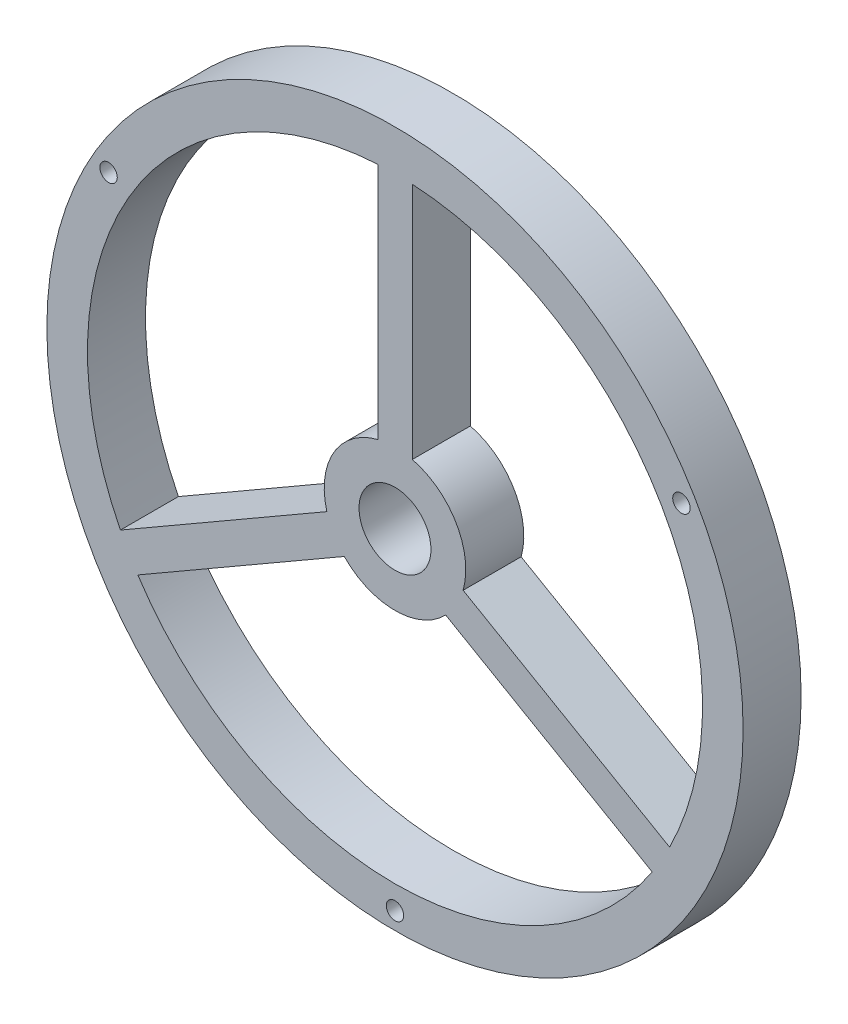
ISO-10303-21;
HEADER;
FILE_DESCRIPTION(('STEP AP214'),'2;1');
FILE_NAME('part.step','',(''),(''),'','','');
FILE_SCHEMA(('AUTOMOTIVE_DESIGN { 1 0 10303 214 1 1 1 1 }'));
ENDSEC;
DATA;
#1=APPLICATION_CONTEXT('core data for automotive mechanical design processes');
#2=APPLICATION_PROTOCOL_DEFINITION('international standard','automotive_design',2000,#1);
#3=PRODUCT_CONTEXT('',#1,'mechanical');
#4=PRODUCT('Part','Part','',(#3));
#5=PRODUCT_RELATED_PRODUCT_CATEGORY('part','',(#4));
#6=PRODUCT_DEFINITION_FORMATION('','',#4);
#7=PRODUCT_DEFINITION_CONTEXT('part definition',#1,'design');
#8=PRODUCT_DEFINITION('design','',#6,#7);
#9=PRODUCT_DEFINITION_SHAPE('','',#8);
#10=(LENGTH_UNIT() NAMED_UNIT(*) SI_UNIT(.MILLI.,.METRE.));
#11=(NAMED_UNIT(*) PLANE_ANGLE_UNIT() SI_UNIT($,.RADIAN.));
#12=(NAMED_UNIT(*) SI_UNIT($,.STERADIAN.) SOLID_ANGLE_UNIT());
#13=UNCERTAINTY_MEASURE_WITH_UNIT(LENGTH_MEASURE(1.E-05),#10,'distance_accuracy_value','');
#14=(GEOMETRIC_REPRESENTATION_CONTEXT(3) GLOBAL_UNCERTAINTY_ASSIGNED_CONTEXT((#13)) GLOBAL_UNIT_ASSIGNED_CONTEXT((#10,
#11,#12)) REPRESENTATION_CONTEXT('',''));
#15=CARTESIAN_POINT('',(0.,0.,0.));
#16=DIRECTION('',(0.,0.,1.));
#17=DIRECTION('',(1.,0.,0.));
#18=AXIS2_PLACEMENT_3D('',#15,#16,#17);
#19=CARTESIAN_POINT('',(48.2964743549606,27.9249074552953,5.));
#20=DIRECTION('',(0.,0.,-1.));
#21=DIRECTION('',(-1.,0.,0.));
#22=AXIS2_PLACEMENT_3D('',#19,#20,#21);
#23=CYLINDRICAL_SURFACE('',#22,26.5);
#24=CARTESIAN_POINT('',(48.2964743549606,27.9249074552953,0.));
#25=DIRECTION('',(0.,0.,1.));
#26=DIRECTION('',(1.,0.,0.));
#27=AXIS2_PLACEMENT_3D('',#24,#25,#26);
#28=CIRCLE('',#27,26.5);
#29=CARTESIAN_POINT('',(71.9593528297398,15.995189005649,0.));
#30=VERTEX_POINT('',#29);
#31=CARTESIAN_POINT('',(49.7879309777147,54.3829035461265,0.));
#32=VERTEX_POINT('',#31);
#33=EDGE_CURVE('E215',#30,#32,#28,.T.);
#34=ORIENTED_EDGE('',*,*,#33,.F.);
#35=DIRECTION('',(0.,0.,-1.));
#36=VECTOR('',#35,1.);
#37=CARTESIAN_POINT('',(71.9593528297398,15.995189005649,5.));
#38=LINE('',#37,#36);
#39=CARTESIAN_POINT('',(71.9593528297398,15.995189005649,5.));
#40=VERTEX_POINT('',#39);
#41=EDGE_CURVE('E11',#40,#30,#38,.T.);
#42=ORIENTED_EDGE('',*,*,#41,.F.);
#43=CARTESIAN_POINT('',(48.2964743549606,27.9249074552953,5.));
#44=DIRECTION('',(0.,0.,1.));
#45=DIRECTION('',(1.,0.,0.));
#46=AXIS2_PLACEMENT_3D('',#43,#44,#45);
#47=CIRCLE('',#46,26.5);
#48=CARTESIAN_POINT('',(49.7879309777147,54.3829035461265,5.));
#49=VERTEX_POINT('',#48);
#50=EDGE_CURVE('E147',#40,#49,#47,.T.);
#51=ORIENTED_EDGE('',*,*,#50,.T.);
#52=DIRECTION('',(0.,0.,-1.));
#53=VECTOR('',#52,1.);
#54=CARTESIAN_POINT('',(49.7879309777147,54.3829035461265,5.));
#55=LINE('',#54,#53);
#56=EDGE_CURVE('E54',#49,#32,#55,.T.);
#57=ORIENTED_EDGE('',*,*,#56,.T.);
#58=EDGE_LOOP('',(#34,#42,#51,#57));
#59=FACE_BOUND('',#58,.T.);
#60=ADVANCED_FACE('F35',(#59),#23,.F.);
#61=CARTESIAN_POINT('',(24.9159582160477,43.1557055494579,5.));
#62=DIRECTION('',(-0.5,-0.866025403784439,0.));
#63=DIRECTION('',(0.866025403784439,-0.5,0.));
#64=AXIS2_PLACEMENT_3D('',#61,#62,#63);
#65=PLANE('',#64);
#66=DIRECTION('',(-0.866025403784439,0.5,0.));
#67=VECTOR('',#66,1.);
#68=CARTESIAN_POINT('',(24.9159582160477,43.1557055494579,0.));
#69=LINE('',#68,#67);
#70=CARTESIAN_POINT('',(54.1670212007574,26.267596461153,0.));
#71=VERTEX_POINT('',#70);
#72=EDGE_CURVE('E152',#30,#71,#69,.T.);
#73=ORIENTED_EDGE('',*,*,#72,.T.);
#74=DIRECTION('',(0.,0.,-1.));
#75=VECTOR('',#74,1.);
#76=CARTESIAN_POINT('',(54.1670212007574,26.267596461153,5.));
#77=LINE('',#76,#75);
#78=CARTESIAN_POINT('',(54.1670212007574,26.267596461153,5.));
#79=VERTEX_POINT('',#78);
#80=EDGE_CURVE('E45',#79,#71,#77,.T.);
#81=ORIENTED_EDGE('',*,*,#80,.F.);
#82=DIRECTION('',(-0.866025403784439,0.5,0.));
#83=VECTOR('',#82,1.);
#84=CARTESIAN_POINT('',(24.9159582160477,43.1557055494579,5.));
#85=LINE('',#84,#83);
#86=EDGE_CURVE('E139',#40,#79,#85,.T.);
#87=ORIENTED_EDGE('',*,*,#86,.F.);
#88=ORIENTED_EDGE('',*,*,#41,.T.);
#89=EDGE_LOOP('',(#73,#81,#87,#88));
#90=FACE_BOUND('',#89,.T.);
#91=ADVANCED_FACE('F150',(#90),#65,.F.);
#92=CARTESIAN_POINT('',(48.2964743549606,27.9249074552953,5.));
#93=DIRECTION('',(0.,0.,-1.));
#94=DIRECTION('',(-1.,0.,0.));
#95=AXIS2_PLACEMENT_3D('',#92,#93,#94);
#96=CYLINDRICAL_SURFACE('',#95,6.1);
#97=CARTESIAN_POINT('',(48.2964743549606,27.9249074552953,0.));
#98=DIRECTION('',(0.,0.,1.));
#99=DIRECTION('',(1.,0.,0.));
#100=AXIS2_PLACEMENT_3D('',#97,#98,#99);
#101=CIRCLE('',#100,6.1);
#102=CARTESIAN_POINT('',(49.7879309777147,33.8397664681918,0.));
#103=VERTEX_POINT('',#102);
#104=EDGE_CURVE('E191',#71,#103,#101,.T.);
#105=ORIENTED_EDGE('',*,*,#104,.T.);
#106=DIRECTION('',(0.,0.,-1.));
#107=VECTOR('',#106,1.);
#108=CARTESIAN_POINT('',(49.7879309777147,33.8397664681918,5.));
#109=LINE('',#108,#107);
#110=CARTESIAN_POINT('',(49.7879309777147,33.8397664681918,5.));
#111=VERTEX_POINT('',#110);
#112=EDGE_CURVE('E92',#111,#103,#109,.T.);
#113=ORIENTED_EDGE('',*,*,#112,.F.);
#114=CARTESIAN_POINT('',(48.2964743549606,27.9249074552953,5.));
#115=DIRECTION('',(0.,0.,1.));
#116=DIRECTION('',(1.,0.,0.));
#117=AXIS2_PLACEMENT_3D('',#114,#115,#116);
#118=CIRCLE('',#117,6.1);
#119=EDGE_CURVE('E131',#79,#111,#118,.T.);
#120=ORIENTED_EDGE('',*,*,#119,.F.);
#121=ORIENTED_EDGE('',*,*,#80,.T.);
#122=EDGE_LOOP('',(#105,#113,#120,#121));
#123=FACE_BOUND('',#122,.T.);
#124=ADVANCED_FACE('F133',(#123),#96,.T.);
#125=CARTESIAN_POINT('',(46.8483422096142,33.8505224689132,0.));
#126=VERTEX_POINT('',#125);
#127=CARTESIAN_POINT('',(42.4259275091637,26.267596461153,0.));
#128=VERTEX_POINT('',#127);
#129=EDGE_CURVE('E192',#126,#128,#101,.T.);
#130=ORIENTED_EDGE('',*,*,#129,.T.);
#131=DIRECTION('',(0.,0.,-1.));
#132=VECTOR('',#131,1.);
#133=CARTESIAN_POINT('',(42.4259275091637,26.267596461153,5.));
#134=LINE('',#133,#132);
#135=CARTESIAN_POINT('',(42.4259275091637,26.267596461153,5.));
#136=VERTEX_POINT('',#135);
#137=EDGE_CURVE('E164',#136,#128,#134,.T.);
#138=ORIENTED_EDGE('',*,*,#137,.F.);
#139=CARTESIAN_POINT('',(46.8483422096142,33.8505224689132,5.));
#140=VERTEX_POINT('',#139);
#141=EDGE_CURVE('E141',#140,#136,#118,.T.);
#142=ORIENTED_EDGE('',*,*,#141,.F.);
#143=DIRECTION('',(0.,0.,-1.));
#144=VECTOR('',#143,1.);
#145=CARTESIAN_POINT('',(46.8483422096142,33.8505224689132,5.));
#146=LINE('',#145,#144);
#147=EDGE_CURVE('E157',#140,#126,#146,.T.);
#148=ORIENTED_EDGE('',*,*,#147,.T.);
#149=EDGE_LOOP('',(#130,#138,#142,#148));
#150=FACE_BOUND('',#149,.T.);
#151=ADVANCED_FACE('F292',(#150),#96,.T.);
#152=CARTESIAN_POINT('',(-0.767721038567435,1.32973184483834,5.));
#153=DIRECTION('',(-0.5,0.866025403784438,0.));
#154=DIRECTION('',(-0.866025403784438,-0.5,0.));
#155=AXIS2_PLACEMENT_3D('',#152,#153,#154);
#156=PLANE('',#155);
#157=DIRECTION('',(0.866025403784439,0.5,0.));
#158=VECTOR('',#157,1.);
#159=CARTESIAN_POINT('',(-0.767721038567435,1.32973184483834,0.));
#160=LINE('',#159,#158);
#161=CARTESIAN_POINT('',(24.6335958801814,15.995189005649,0.));
#162=VERTEX_POINT('',#161);
#163=EDGE_CURVE('E204',#162,#128,#160,.T.);
#164=ORIENTED_EDGE('',*,*,#163,.F.);
#165=DIRECTION('',(0.,0.,-1.));
#166=VECTOR('',#165,1.);
#167=CARTESIAN_POINT('',(24.6335958801814,15.995189005649,5.));
#168=LINE('',#167,#166);
#169=CARTESIAN_POINT('',(24.6335958801814,15.995189005649,5.));
#170=VERTEX_POINT('',#169);
#171=EDGE_CURVE('E162',#170,#162,#168,.T.);
#172=ORIENTED_EDGE('',*,*,#171,.F.);
#173=DIRECTION('',(0.866025403784439,0.5,0.));
#174=VECTOR('',#173,1.);
#175=CARTESIAN_POINT('',(-0.767721038567435,1.32973184483834,5.));
#176=LINE('',#175,#174);
#177=EDGE_CURVE('E237',#170,#136,#176,.T.);
#178=ORIENTED_EDGE('',*,*,#177,.T.);
#179=ORIENTED_EDGE('',*,*,#137,.T.);
#180=EDGE_LOOP('',(#164,#172,#178,#179));
#181=FACE_BOUND('',#180,.T.);
#182=ADVANCED_FACE('F288',(#181),#156,.T.);
#183=CARTESIAN_POINT('',(48.2964743549606,27.9249074552953,5.));
#184=DIRECTION('',(0.,0.,-1.));
#185=DIRECTION('',(-1.,0.,0.));
#186=AXIS2_PLACEMENT_3D('',#183,#184,#185);
#187=CYLINDRICAL_SURFACE('',#186,26.5);
#188=CARTESIAN_POINT('',(48.2964743549606,27.9249074552953,0.));
#189=DIRECTION('',(0.,0.,1.));
#190=DIRECTION('',(1.,0.,0.));
#191=AXIS2_PLACEMENT_3D('',#188,#189,#190);
#192=CIRCLE('',#191,26.5);
#193=CARTESIAN_POINT('',(46.8483422096142,54.3853101976878,0.));
#194=VERTEX_POINT('',#193);
#195=EDGE_CURVE('E207',#194,#162,#192,.T.);
#196=ORIENTED_EDGE('',*,*,#195,.F.);
#197=DIRECTION('',(0.,0.,-1.));
#198=VECTOR('',#197,1.);
#199=CARTESIAN_POINT('',(46.8483422096142,54.3853101976878,5.));
#200=LINE('',#199,#198);
#201=CARTESIAN_POINT('',(46.8483422096142,54.3853101976878,5.));
#202=VERTEX_POINT('',#201);
#203=EDGE_CURVE('E160',#202,#194,#200,.T.);
#204=ORIENTED_EDGE('',*,*,#203,.F.);
#205=CARTESIAN_POINT('',(48.2964743549606,27.9249074552953,5.));
#206=DIRECTION('',(0.,0.,1.));
#207=DIRECTION('',(1.,0.,0.));
#208=AXIS2_PLACEMENT_3D('',#205,#206,#207);
#209=CIRCLE('',#208,26.5);
#210=EDGE_CURVE('E240',#202,#170,#209,.T.);
#211=ORIENTED_EDGE('',*,*,#210,.T.);
#212=ORIENTED_EDGE('',*,*,#171,.T.);
#213=EDGE_LOOP('',(#196,#204,#211,#212));
#214=FACE_BOUND('',#213,.T.);
#215=ADVANCED_FACE('F285',(#214),#187,.F.);
#216=CARTESIAN_POINT('',(0.732278961432563,-1.26834436651497,5.));
#217=DIRECTION('',(0.5,-0.866025403784439,0.));
#218=DIRECTION('',(0.866025403784439,0.5,0.));
#219=AXIS2_PLACEMENT_3D('',#216,#217,#218);
#220=PLANE('',#219);
#221=DIRECTION('',(-0.866025403784439,-0.5,0.));
#222=VECTOR('',#221,1.);
#223=CARTESIAN_POINT('',(0.732278961432563,-1.26834436651497,0.));
#224=LINE('',#223,#222);
#225=CARTESIAN_POINT('',(43.9259275091637,23.6695202497997,0.));
#226=VERTEX_POINT('',#225);
#227=CARTESIAN_POINT('',(26.1335958801814,13.3971127942957,0.));
#228=VERTEX_POINT('',#227);
#229=EDGE_CURVE('E187',#226,#228,#224,.T.);
#230=ORIENTED_EDGE('',*,*,#229,.F.);
#231=DIRECTION('',(0.,0.,-1.));
#232=VECTOR('',#231,1.);
#233=CARTESIAN_POINT('',(43.9259275091637,23.6695202497997,5.));
#234=LINE('',#233,#232);
#235=CARTESIAN_POINT('',(43.9259275091637,23.6695202497997,5.));
#236=VERTEX_POINT('',#235);
#237=EDGE_CURVE('E39',#236,#226,#234,.T.);
#238=ORIENTED_EDGE('',*,*,#237,.F.);
#239=DIRECTION('',(-0.866025403784439,-0.5,0.));
#240=VECTOR('',#239,1.);
#241=CARTESIAN_POINT('',(0.732278961432563,-1.26834436651497,5.));
#242=LINE('',#241,#240);
#243=CARTESIAN_POINT('',(26.1335958801814,13.3971127942957,5.));
#244=VERTEX_POINT('',#243);
#245=EDGE_CURVE('E223',#236,#244,#242,.T.);
#246=ORIENTED_EDGE('',*,*,#245,.T.);
#247=DIRECTION('',(0.,0.,-1.));
#248=VECTOR('',#247,1.);
#249=CARTESIAN_POINT('',(26.1335958801814,13.3971127942957,5.));
#250=LINE('',#249,#248);
#251=EDGE_CURVE('E166',#244,#228,#250,.T.);
#252=ORIENTED_EDGE('',*,*,#251,.T.);
#253=EDGE_LOOP('',(#230,#238,#246,#252));
#254=FACE_BOUND('',#253,.T.);
#255=ADVANCED_FACE('F37',(#254),#220,.T.);
#256=CARTESIAN_POINT('',(52.6670212007574,23.6695202497997,0.));
#257=VERTEX_POINT('',#256);
#258=EDGE_CURVE('E180',#226,#257,#101,.T.);
#259=ORIENTED_EDGE('',*,*,#258,.T.);
#260=DIRECTION('',(0.,0.,-1.));
#261=VECTOR('',#260,1.);
#262=CARTESIAN_POINT('',(52.6670212007574,23.6695202497997,5.));
#263=LINE('',#262,#261);
#264=CARTESIAN_POINT('',(52.6670212007574,23.6695202497997,5.));
#265=VERTEX_POINT('',#264);
#266=EDGE_CURVE('E170',#265,#257,#263,.T.);
#267=ORIENTED_EDGE('',*,*,#266,.F.);
#268=EDGE_CURVE('E142',#236,#265,#118,.T.);
#269=ORIENTED_EDGE('',*,*,#268,.F.);
#270=ORIENTED_EDGE('',*,*,#237,.T.);
#271=EDGE_LOOP('',(#259,#267,#269,#270));
#272=FACE_BOUND('',#271,.T.);
#273=ADVANCED_FACE('F179',(#272),#96,.T.);
#274=CARTESIAN_POINT('',(23.4159582160477,40.5576293381045,5.));
#275=DIRECTION('',(0.5,0.866025403784439,0.));
#276=DIRECTION('',(-0.866025403784439,0.5,0.));
#277=AXIS2_PLACEMENT_3D('',#274,#275,#276);
#278=PLANE('',#277);
#279=DIRECTION('',(0.866025403784439,-0.5,0.));
#280=VECTOR('',#279,1.);
#281=CARTESIAN_POINT('',(23.4159582160477,40.5576293381045,0.));
#282=LINE('',#281,#280);
#283=CARTESIAN_POINT('',(70.4593528297398,13.3971127942957,0.));
#284=VERTEX_POINT('',#283);
#285=EDGE_CURVE('E189',#257,#284,#282,.T.);
#286=ORIENTED_EDGE('',*,*,#285,.T.);
#287=DIRECTION('',(0.,0.,-1.));
#288=VECTOR('',#287,1.);
#289=CARTESIAN_POINT('',(70.4593528297398,13.3971127942957,5.));
#290=LINE('',#289,#288);
#291=CARTESIAN_POINT('',(70.4593528297398,13.3971127942957,5.));
#292=VERTEX_POINT('',#291);
#293=EDGE_CURVE('E168',#292,#284,#290,.T.);
#294=ORIENTED_EDGE('',*,*,#293,.F.);
#295=DIRECTION('',(0.866025403784439,-0.5,0.));
#296=VECTOR('',#295,1.);
#297=CARTESIAN_POINT('',(23.4159582160477,40.5576293381045,5.));
#298=LINE('',#297,#296);
#299=EDGE_CURVE('E228',#265,#292,#298,.T.);
#300=ORIENTED_EDGE('',*,*,#299,.F.);
#301=ORIENTED_EDGE('',*,*,#266,.T.);
#302=EDGE_LOOP('',(#286,#294,#300,#301));
#303=FACE_BOUND('',#302,.T.);
#304=ADVANCED_FACE('F296',(#303),#278,.F.);
#305=CARTESIAN_POINT('',(49.7879309777147,0.,5.));
#306=DIRECTION('',(1.,0.,0.));
#307=DIRECTION('',(0.,1.,0.));
#308=AXIS2_PLACEMENT_3D('',#305,#306,#307);
#309=PLANE('',#308);
#310=DIRECTION('',(0.,-1.,0.));
#311=VECTOR('',#310,1.);
#312=CARTESIAN_POINT('',(49.7879309777147,0.,0.));
#313=LINE('',#312,#311);
#314=EDGE_CURVE('E218',#32,#103,#313,.T.);
#315=ORIENTED_EDGE('',*,*,#314,.F.);
#316=ORIENTED_EDGE('',*,*,#56,.F.);
#317=DIRECTION('',(0.,-1.,0.));
#318=VECTOR('',#317,1.);
#319=CARTESIAN_POINT('',(49.7879309777147,0.,5.));
#320=LINE('',#319,#318);
#321=EDGE_CURVE('E138',#49,#111,#320,.T.);
#322=ORIENTED_EDGE('',*,*,#321,.T.);
#323=ORIENTED_EDGE('',*,*,#112,.T.);
#324=EDGE_LOOP('',(#315,#316,#322,#323));
#325=FACE_BOUND('',#324,.T.);
#326=ADVANCED_FACE('F280',(#325),#309,.T.);
#327=CARTESIAN_POINT('',(48.2964743549606,27.9249074552953,5.));
#328=DIRECTION('',(0.,0.,-1.));
#329=DIRECTION('',(-1.,0.,0.));
#330=AXIS2_PLACEMENT_3D('',#327,#328,#329);
#331=CYLINDRICAL_SURFACE('',#330,30.);
#332=CARTESIAN_POINT('',(48.2964743549606,27.9249074552953,5.));
#333=DIRECTION('',(0.,0.,1.));
#334=DIRECTION('',(1.,0.,0.));
#335=AXIS2_PLACEMENT_3D('',#332,#333,#334);
#336=CIRCLE('',#335,30.);
#337=CARTESIAN_POINT('',(78.2964743549606,27.9249074552953,5.));
#338=VERTEX_POINT('',#337);
#339=EDGE_CURVE('E245',#338,#338,#336,.T.);
#340=ORIENTED_EDGE('',*,*,#339,.F.);
#341=EDGE_LOOP('',(#340));
#342=FACE_BOUND('',#341,.T.);
#343=CARTESIAN_POINT('',(48.2964743549606,27.9249074552953,0.));
#344=DIRECTION('',(0.,0.,1.));
#345=DIRECTION('',(1.,0.,0.));
#346=AXIS2_PLACEMENT_3D('',#343,#344,#345);
#347=CIRCLE('',#346,30.);
#348=CARTESIAN_POINT('',(78.2964743549606,27.9249074552953,0.));
#349=VERTEX_POINT('',#348);
#350=EDGE_CURVE('E212',#349,#349,#347,.T.);
#351=ORIENTED_EDGE('',*,*,#350,.T.);
#352=EDGE_LOOP('',(#351));
#353=FACE_BOUND('',#352,.T.);
#354=ADVANCED_FACE('F276',(#342,#353),#331,.T.);
#355=CARTESIAN_POINT('',(46.8483422096142,0.,5.));
#356=DIRECTION('',(1.,0.,0.));
#357=DIRECTION('',(0.,1.,0.));
#358=AXIS2_PLACEMENT_3D('',#355,#356,#357);
#359=PLANE('',#358);
#360=DIRECTION('',(0.,-1.,0.));
#361=VECTOR('',#360,1.);
#362=CARTESIAN_POINT('',(46.8483422096142,0.,0.));
#363=LINE('',#362,#361);
#364=EDGE_CURVE('E210',#194,#126,#363,.T.);
#365=ORIENTED_EDGE('',*,*,#364,.T.);
#366=ORIENTED_EDGE('',*,*,#147,.F.);
#367=DIRECTION('',(0.,-1.,0.));
#368=VECTOR('',#367,1.);
#369=CARTESIAN_POINT('',(46.8483422096142,0.,5.));
#370=LINE('',#369,#368);
#371=EDGE_CURVE('E243',#202,#140,#370,.T.);
#372=ORIENTED_EDGE('',*,*,#371,.F.);
#373=ORIENTED_EDGE('',*,*,#203,.T.);
#374=EDGE_LOOP('',(#365,#366,#372,#373));
#375=FACE_BOUND('',#374,.T.);
#376=ADVANCED_FACE('F279',(#375),#359,.F.);
#377=CARTESIAN_POINT('',(48.2964743549606,27.9249074552953,5.));
#378=DIRECTION('',(0.,0.,-1.));
#379=DIRECTION('',(-1.,0.,0.));
#380=AXIS2_PLACEMENT_3D('',#377,#378,#379);
#381=CYLINDRICAL_SURFACE('',#380,26.5);
#382=CARTESIAN_POINT('',(48.2964743549606,27.9249074552953,0.));
#383=DIRECTION('',(0.,0.,1.));
#384=DIRECTION('',(1.,0.,0.));
#385=AXIS2_PLACEMENT_3D('',#382,#383,#384);
#386=CIRCLE('',#385,26.5);
#387=EDGE_CURVE('E202',#228,#284,#386,.T.);
#388=ORIENTED_EDGE('',*,*,#387,.F.);
#389=ORIENTED_EDGE('',*,*,#251,.F.);
#390=CARTESIAN_POINT('',(48.2964743549606,27.9249074552953,5.));
#391=DIRECTION('',(0.,0.,1.));
#392=DIRECTION('',(1.,0.,0.));
#393=AXIS2_PLACEMENT_3D('',#390,#391,#392);
#394=CIRCLE('',#393,26.5);
#395=EDGE_CURVE('E234',#244,#292,#394,.T.);
#396=ORIENTED_EDGE('',*,*,#395,.T.);
#397=ORIENTED_EDGE('',*,*,#293,.T.);
#398=EDGE_LOOP('',(#388,#389,#396,#397));
#399=FACE_BOUND('',#398,.T.);
#400=ADVANCED_FACE('F263',(#399),#381,.F.);
#401=CARTESIAN_POINT('',(48.2964743549606,27.9249074552953,5.));
#402=DIRECTION('',(0.,0.,-1.));
#403=DIRECTION('',(-1.,0.,0.));
#404=AXIS2_PLACEMENT_3D('',#401,#402,#403);
#405=CYLINDRICAL_SURFACE('',#404,3.1);
#406=CARTESIAN_POINT('',(48.2964743549606,27.9249074552953,5.));
#407=DIRECTION('',(0.,0.,1.));
#408=DIRECTION('',(1.,0.,0.));
#409=AXIS2_PLACEMENT_3D('',#406,#407,#408);
#410=CIRCLE('',#409,3.1);
#411=CARTESIAN_POINT('',(51.3964743549606,27.9249074552953,5.));
#412=VERTEX_POINT('',#411);
#413=EDGE_CURVE('E169',#412,#412,#410,.T.);
#414=ORIENTED_EDGE('',*,*,#413,.T.);
#415=EDGE_LOOP('',(#414));
#416=FACE_BOUND('',#415,.T.);
#417=CARTESIAN_POINT('',(48.2964743549606,27.9249074552953,0.));
#418=DIRECTION('',(0.,0.,1.));
#419=DIRECTION('',(1.,0.,0.));
#420=AXIS2_PLACEMENT_3D('',#417,#418,#419);
#421=CIRCLE('',#420,3.1);
#422=CARTESIAN_POINT('',(51.3964743549606,27.9249074552953,0.));
#423=VERTEX_POINT('',#422);
#424=EDGE_CURVE('E221',#423,#423,#421,.T.);
#425=ORIENTED_EDGE('',*,*,#424,.F.);
#426=EDGE_LOOP('',(#425));
#427=FACE_BOUND('',#426,.T.);
#428=ADVANCED_FACE('F251',(#416,#427),#405,.F.);
#429=CARTESIAN_POINT('',(0.,0.,5.));
#430=DIRECTION('',(0.,0.,1.));
#431=DIRECTION('',(1.,0.,0.));
#432=AXIS2_PLACEMENT_3D('',#429,#430,#431);
#433=PLANE('',#432);
#434=CARTESIAN_POINT('',(23.6147503471041,42.1749074552953,5.));
#435=DIRECTION('',(0.,0.,1.));
#436=DIRECTION('',(1.,0.,0.));
#437=AXIS2_PLACEMENT_3D('',#434,#435,#436);
#438=CIRCLE('',#437,0.750000000000002);
#439=CARTESIAN_POINT('',(24.3647503471041,42.1749074552953,5.));
#440=VERTEX_POINT('',#439);
#441=EDGE_CURVE('E196',#440,#440,#438,.T.);
#442=ORIENTED_EDGE('',*,*,#441,.F.);
#443=EDGE_LOOP('',(#442));
#444=FACE_BOUND('',#443,.T.);
#445=CARTESIAN_POINT('',(48.2964743549606,-0.575092544704728,5.));
#446=DIRECTION('',(0.,0.,1.));
#447=DIRECTION('',(1.,0.,0.));
#448=AXIS2_PLACEMENT_3D('',#445,#446,#447);
#449=CIRCLE('',#448,0.749999999999999);
#450=CARTESIAN_POINT('',(49.0464743549606,-0.575092544704728,5.));
#451=VERTEX_POINT('',#450);
#452=EDGE_CURVE('E508',#451,#451,#449,.T.);
#453=ORIENTED_EDGE('',*,*,#452,.F.);
#454=EDGE_LOOP('',(#453));
#455=FACE_BOUND('',#454,.T.);
#456=CARTESIAN_POINT('',(72.9781983628171,42.1749074552953,5.));
#457=DIRECTION('',(0.,0.,1.));
#458=DIRECTION('',(1.,0.,0.));
#459=AXIS2_PLACEMENT_3D('',#456,#457,#458);
#460=CIRCLE('',#459,0.749999999999999);
#461=CARTESIAN_POINT('',(73.7281983628171,42.1749074552953,5.));
#462=VERTEX_POINT('',#461);
#463=EDGE_CURVE('E230',#462,#462,#460,.T.);
#464=ORIENTED_EDGE('',*,*,#463,.F.);
#465=EDGE_LOOP('',(#464));
#466=FACE_BOUND('',#465,.T.);
#467=ORIENTED_EDGE('',*,*,#245,.F.);
#468=ORIENTED_EDGE('',*,*,#268,.T.);
#469=ORIENTED_EDGE('',*,*,#299,.T.);
#470=ORIENTED_EDGE('',*,*,#395,.F.);
#471=EDGE_LOOP('',(#467,#468,#469,#470));
#472=FACE_BOUND('',#471,.T.);
#473=ORIENTED_EDGE('',*,*,#141,.T.);
#474=ORIENTED_EDGE('',*,*,#177,.F.);
#475=ORIENTED_EDGE('',*,*,#210,.F.);
#476=ORIENTED_EDGE('',*,*,#371,.T.);
#477=EDGE_LOOP('',(#473,#474,#475,#476));
#478=FACE_BOUND('',#477,.T.);
#479=ORIENTED_EDGE('',*,*,#339,.T.);
#480=EDGE_LOOP('',(#479));
#481=FACE_BOUND('',#480,.T.);
#482=ORIENTED_EDGE('',*,*,#50,.F.);
#483=ORIENTED_EDGE('',*,*,#86,.T.);
#484=ORIENTED_EDGE('',*,*,#119,.T.);
#485=ORIENTED_EDGE('',*,*,#321,.F.);
#486=EDGE_LOOP('',(#482,#483,#484,#485));
#487=FACE_BOUND('',#486,.T.);
#488=ORIENTED_EDGE('',*,*,#413,.F.);
#489=EDGE_LOOP('',(#488));
#490=FACE_BOUND('',#489,.T.);
#491=ADVANCED_FACE('F145',(#444,#455,#466,#472,#478,#481,#487,#490),#433,.T.);
#492=CARTESIAN_POINT('',(0.,0.,0.));
#493=DIRECTION('',(0.,0.,1.));
#494=DIRECTION('',(1.,0.,0.));
#495=AXIS2_PLACEMENT_3D('',#492,#493,#494);
#496=PLANE('',#495);
#497=CARTESIAN_POINT('',(23.6147503471041,42.1749074552953,0.));
#498=DIRECTION('',(0.,0.,1.));
#499=DIRECTION('',(1.,0.,0.));
#500=AXIS2_PLACEMENT_3D('',#497,#498,#499);
#501=CIRCLE('',#500,0.750000000000002);
#502=CARTESIAN_POINT('',(24.3647503471041,42.1749074552953,0.));
#503=VERTEX_POINT('',#502);
#504=EDGE_CURVE('E193',#503,#503,#501,.T.);
#505=ORIENTED_EDGE('',*,*,#504,.T.);
#506=EDGE_LOOP('',(#505));
#507=FACE_BOUND('',#506,.T.);
#508=CARTESIAN_POINT('',(48.2964743549606,-0.575092544704728,0.));
#509=DIRECTION('',(0.,0.,1.));
#510=DIRECTION('',(1.,0.,0.));
#511=AXIS2_PLACEMENT_3D('',#508,#509,#510);
#512=CIRCLE('',#511,0.749999999999999);
#513=CARTESIAN_POINT('',(49.0464743549606,-0.575092544704728,0.));
#514=VERTEX_POINT('',#513);
#515=EDGE_CURVE('E505',#514,#514,#512,.T.);
#516=ORIENTED_EDGE('',*,*,#515,.T.);
#517=EDGE_LOOP('',(#516));
#518=FACE_BOUND('',#517,.T.);
#519=CARTESIAN_POINT('',(72.9781983628171,42.1749074552953,0.));
#520=DIRECTION('',(0.,0.,1.));
#521=DIRECTION('',(1.,0.,0.));
#522=AXIS2_PLACEMENT_3D('',#519,#520,#521);
#523=CIRCLE('',#522,0.749999999999999);
#524=CARTESIAN_POINT('',(73.7281983628171,42.1749074552953,0.));
#525=VERTEX_POINT('',#524);
#526=EDGE_CURVE('E512',#525,#525,#523,.T.);
#527=ORIENTED_EDGE('',*,*,#526,.T.);
#528=EDGE_LOOP('',(#527));
#529=FACE_BOUND('',#528,.T.);
#530=ORIENTED_EDGE('',*,*,#229,.T.);
#531=ORIENTED_EDGE('',*,*,#387,.T.);
#532=ORIENTED_EDGE('',*,*,#285,.F.);
#533=ORIENTED_EDGE('',*,*,#258,.F.);
#534=EDGE_LOOP('',(#530,#531,#532,#533));
#535=FACE_BOUND('',#534,.T.);
#536=ORIENTED_EDGE('',*,*,#129,.F.);
#537=ORIENTED_EDGE('',*,*,#364,.F.);
#538=ORIENTED_EDGE('',*,*,#195,.T.);
#539=ORIENTED_EDGE('',*,*,#163,.T.);
#540=EDGE_LOOP('',(#536,#537,#538,#539));
#541=FACE_BOUND('',#540,.T.);
#542=ORIENTED_EDGE('',*,*,#350,.F.);
#543=EDGE_LOOP('',(#542));
#544=FACE_BOUND('',#543,.T.);
#545=ORIENTED_EDGE('',*,*,#33,.T.);
#546=ORIENTED_EDGE('',*,*,#314,.T.);
#547=ORIENTED_EDGE('',*,*,#104,.F.);
#548=ORIENTED_EDGE('',*,*,#72,.F.);
#549=EDGE_LOOP('',(#545,#546,#547,#548));
#550=FACE_BOUND('',#549,.T.);
#551=ORIENTED_EDGE('',*,*,#424,.T.);
#552=EDGE_LOOP('',(#551));
#553=FACE_BOUND('',#552,.T.);
#554=ADVANCED_FACE('F184',(#507,#518,#529,#535,#541,#544,#550,#553),#496,.F.);
#555=CARTESIAN_POINT('',(72.9781983628171,42.1749074552953,0.));
#556=DIRECTION('',(0.,0.,1.));
#557=DIRECTION('',(1.,0.,0.));
#558=AXIS2_PLACEMENT_3D('',#555,#556,#557);
#559=CYLINDRICAL_SURFACE('',#558,0.749999999999999);
#560=ORIENTED_EDGE('',*,*,#526,.F.);
#561=EDGE_LOOP('',(#560));
#562=FACE_BOUND('',#561,.T.);
#563=ORIENTED_EDGE('',*,*,#463,.T.);
#564=EDGE_LOOP('',(#563));
#565=FACE_BOUND('',#564,.T.);
#566=ADVANCED_FACE('F260',(#562,#565),#559,.F.);
#567=CARTESIAN_POINT('',(48.2964743549606,-0.575092544704728,0.));
#568=DIRECTION('',(0.,0.,1.));
#569=DIRECTION('',(1.,0.,0.));
#570=AXIS2_PLACEMENT_3D('',#567,#568,#569);
#571=CYLINDRICAL_SURFACE('',#570,0.749999999999999);
#572=ORIENTED_EDGE('',*,*,#515,.F.);
#573=EDGE_LOOP('',(#572));
#574=FACE_BOUND('',#573,.T.);
#575=ORIENTED_EDGE('',*,*,#452,.T.);
#576=EDGE_LOOP('',(#575));
#577=FACE_BOUND('',#576,.T.);
#578=ADVANCED_FACE('F479',(#574,#577),#571,.F.);
#579=CARTESIAN_POINT('',(23.6147503471041,42.1749074552953,0.));
#580=DIRECTION('',(0.,0.,1.));
#581=DIRECTION('',(1.,0.,0.));
#582=AXIS2_PLACEMENT_3D('',#579,#580,#581);
#583=CYLINDRICAL_SURFACE('',#582,0.750000000000002);
#584=ORIENTED_EDGE('',*,*,#504,.F.);
#585=EDGE_LOOP('',(#584));
#586=FACE_BOUND('',#585,.T.);
#587=ORIENTED_EDGE('',*,*,#441,.T.);
#588=EDGE_LOOP('',(#587));
#589=FACE_BOUND('',#588,.T.);
#590=ADVANCED_FACE('F487',(#586,#589),#583,.F.);
#591=CLOSED_SHELL('',(#60,#91,#124,#151,#182,#215,#255,#273,#304,#326,#354,#376,#400,#428,#491,
#554,#566,#578,#590));
#592=MANIFOLD_SOLID_BREP('B2',#591);
#593=ADVANCED_BREP_SHAPE_REPRESENTATION('',(#18,#592),#14);
#594=SHAPE_DEFINITION_REPRESENTATION(#9,#593);
ENDSEC;
END-ISO-10303-21;
